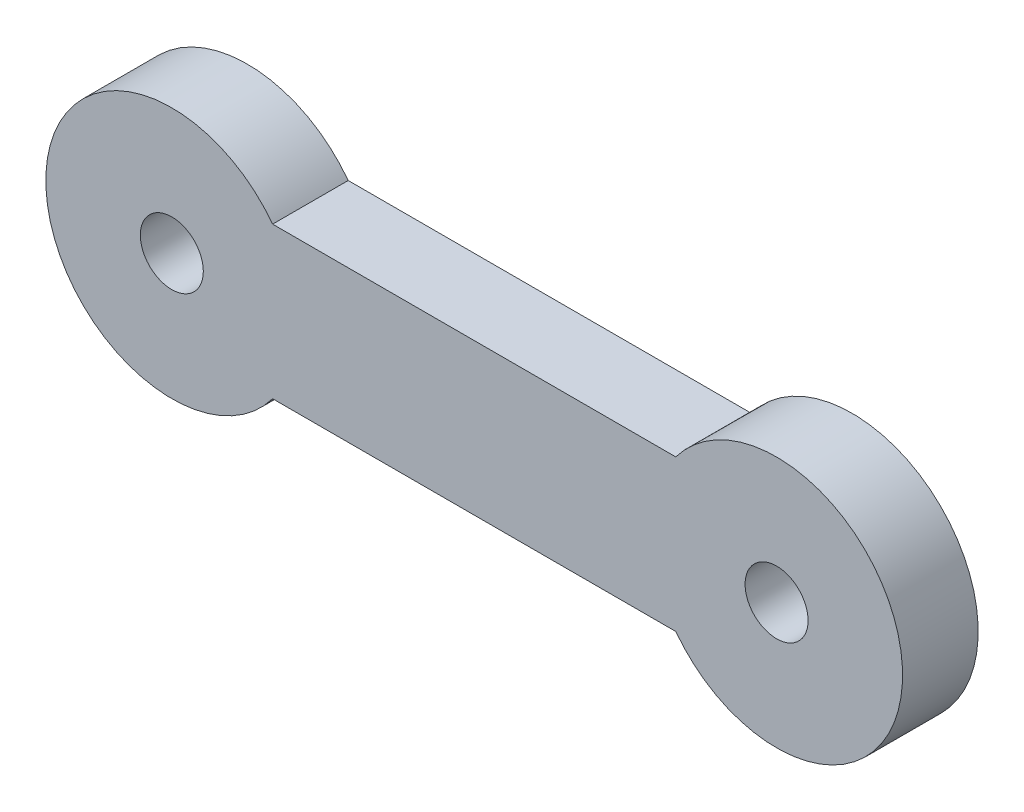
ISO-10303-21;
HEADER;
FILE_DESCRIPTION(('STEP AP214'),'2;1');
FILE_NAME('part.step','',(''),(''),'','','');
FILE_SCHEMA(('AUTOMOTIVE_DESIGN { 1 0 10303 214 1 1 1 1 }'));
ENDSEC;
DATA;
#1=APPLICATION_CONTEXT('core data for automotive mechanical design processes');
#2=APPLICATION_PROTOCOL_DEFINITION('international standard','automotive_design',2000,#1);
#3=PRODUCT_CONTEXT('',#1,'mechanical');
#4=PRODUCT('Part','Part','',(#3));
#5=PRODUCT_RELATED_PRODUCT_CATEGORY('part','',(#4));
#6=PRODUCT_DEFINITION_FORMATION('','',#4);
#7=PRODUCT_DEFINITION_CONTEXT('part definition',#1,'design');
#8=PRODUCT_DEFINITION('design','',#6,#7);
#9=PRODUCT_DEFINITION_SHAPE('','',#8);
#10=(LENGTH_UNIT() NAMED_UNIT(*) SI_UNIT(.MILLI.,.METRE.));
#11=(NAMED_UNIT(*) PLANE_ANGLE_UNIT() SI_UNIT($,.RADIAN.));
#12=(NAMED_UNIT(*) SI_UNIT($,.STERADIAN.) SOLID_ANGLE_UNIT());
#13=UNCERTAINTY_MEASURE_WITH_UNIT(LENGTH_MEASURE(1.E-05),#10,'distance_accuracy_value','');
#14=(GEOMETRIC_REPRESENTATION_CONTEXT(3) GLOBAL_UNCERTAINTY_ASSIGNED_CONTEXT((#13)) GLOBAL_UNIT_ASSIGNED_CONTEXT((#10,
#11,#12)) REPRESENTATION_CONTEXT('',''));
#15=CARTESIAN_POINT('',(0.,0.,0.));
#16=DIRECTION('',(0.,0.,1.));
#17=DIRECTION('',(1.,0.,0.));
#18=AXIS2_PLACEMENT_3D('',#15,#16,#17);
#19=CARTESIAN_POINT('',(-1.30622009569378,0.,3.));
#20=DIRECTION('',(0.,0.,1.));
#21=DIRECTION('',(1.,0.,0.));
#22=AXIS2_PLACEMENT_3D('',#19,#20,#21);
#23=PLANE('',#22);
#24=CARTESIAN_POINT('',(-1.30622009569378,0.,3.));
#25=DIRECTION('',(0.,0.,1.));
#26=DIRECTION('',(1.,0.,0.));
#27=AXIS2_PLACEMENT_3D('',#24,#25,#26);
#28=CIRCLE('',#27,1.25);
#29=CARTESIAN_POINT('',(-0.0562200956937802,0.,3.));
#30=VERTEX_POINT('',#29);
#31=EDGE_CURVE('E100',#30,#30,#28,.T.);
#32=ORIENTED_EDGE('',*,*,#31,.F.);
#33=EDGE_LOOP('',(#32));
#34=FACE_BOUND('',#33,.T.);
#35=CARTESIAN_POINT('',(-1.30622009569378,0.,3.));
#36=DIRECTION('',(0.,0.,1.));
#37=DIRECTION('',(1.,0.,0.));
#38=AXIS2_PLACEMENT_3D('',#35,#36,#37);
#39=CIRCLE('',#38,5.);
#40=CARTESIAN_POINT('',(2.69377990430622,3.,3.));
#41=VERTEX_POINT('',#40);
#42=CARTESIAN_POINT('',(2.69377990430622,-3.,3.));
#43=VERTEX_POINT('',#42);
#44=EDGE_CURVE('E85',#41,#43,#39,.T.);
#45=ORIENTED_EDGE('',*,*,#44,.T.);
#46=DIRECTION('',(1.,0.,0.));
#47=VECTOR('',#46,1.);
#48=CARTESIAN_POINT('',(2.69377990430622,-3.,3.));
#49=LINE('',#48,#47);
#50=CARTESIAN_POINT('',(18.6937799043062,-3.,3.));
#51=VERTEX_POINT('',#50);
#52=EDGE_CURVE('E80',#43,#51,#49,.T.);
#53=ORIENTED_EDGE('',*,*,#52,.T.);
#54=CARTESIAN_POINT('',(22.6937799043062,0.,3.));
#55=DIRECTION('',(0.,0.,1.));
#56=DIRECTION('',(1.,0.,0.));
#57=AXIS2_PLACEMENT_3D('',#54,#55,#56);
#58=CIRCLE('',#57,5.);
#59=CARTESIAN_POINT('',(18.6937799043062,3.,3.));
#60=VERTEX_POINT('',#59);
#61=EDGE_CURVE('E83',#51,#60,#58,.T.);
#62=ORIENTED_EDGE('',*,*,#61,.T.);
#63=DIRECTION('',(-1.,0.,0.));
#64=VECTOR('',#63,1.);
#65=CARTESIAN_POINT('',(2.69377990430622,3.,3.));
#66=LINE('',#65,#64);
#67=EDGE_CURVE('E50',#60,#41,#66,.T.);
#68=ORIENTED_EDGE('',*,*,#67,.T.);
#69=EDGE_LOOP('',(#45,#53,#62,#68));
#70=FACE_BOUND('',#69,.T.);
#71=CARTESIAN_POINT('',(22.6937799043062,0.,3.));
#72=DIRECTION('',(0.,0.,1.));
#73=DIRECTION('',(1.,0.,0.));
#74=AXIS2_PLACEMENT_3D('',#71,#72,#73);
#75=CIRCLE('',#74,1.25);
#76=CARTESIAN_POINT('',(23.9437799043062,0.,3.));
#77=VERTEX_POINT('',#76);
#78=EDGE_CURVE('E115',#77,#77,#75,.T.);
#79=ORIENTED_EDGE('',*,*,#78,.F.);
#80=EDGE_LOOP('',(#79));
#81=FACE_BOUND('',#80,.T.);
#82=ADVANCED_FACE('F33',(#34,#70,#81),#23,.T.);
#83=CARTESIAN_POINT('',(-1.30622009569378,0.,0.));
#84=DIRECTION('',(0.,0.,1.));
#85=DIRECTION('',(1.,0.,0.));
#86=AXIS2_PLACEMENT_3D('',#83,#84,#85);
#87=PLANE('',#86);
#88=CARTESIAN_POINT('',(-1.30622009569378,0.,0.));
#89=DIRECTION('',(0.,0.,1.));
#90=DIRECTION('',(1.,0.,0.));
#91=AXIS2_PLACEMENT_3D('',#88,#89,#90);
#92=CIRCLE('',#91,5.);
#93=CARTESIAN_POINT('',(2.69377990430622,3.,0.));
#94=VERTEX_POINT('',#93);
#95=CARTESIAN_POINT('',(2.69377990430622,-3.,0.));
#96=VERTEX_POINT('',#95);
#97=EDGE_CURVE('E97',#94,#96,#92,.T.);
#98=ORIENTED_EDGE('',*,*,#97,.F.);
#99=DIRECTION('',(-1.,0.,0.));
#100=VECTOR('',#99,1.);
#101=CARTESIAN_POINT('',(2.69377990430622,3.,0.));
#102=LINE('',#101,#100);
#103=CARTESIAN_POINT('',(18.6937799043062,3.,0.));
#104=VERTEX_POINT('',#103);
#105=EDGE_CURVE('E73',#104,#94,#102,.T.);
#106=ORIENTED_EDGE('',*,*,#105,.F.);
#107=CARTESIAN_POINT('',(22.6937799043062,0.,0.));
#108=DIRECTION('',(0.,0.,1.));
#109=DIRECTION('',(1.,0.,0.));
#110=AXIS2_PLACEMENT_3D('',#107,#108,#109);
#111=CIRCLE('',#110,5.);
#112=CARTESIAN_POINT('',(18.6937799043062,-3.,0.));
#113=VERTEX_POINT('',#112);
#114=EDGE_CURVE('E67',#113,#104,#111,.T.);
#115=ORIENTED_EDGE('',*,*,#114,.F.);
#116=DIRECTION('',(1.,0.,0.));
#117=VECTOR('',#116,1.);
#118=CARTESIAN_POINT('',(2.69377990430622,-3.,0.));
#119=LINE('',#118,#117);
#120=EDGE_CURVE('E89',#96,#113,#119,.T.);
#121=ORIENTED_EDGE('',*,*,#120,.F.);
#122=EDGE_LOOP('',(#98,#106,#115,#121));
#123=FACE_BOUND('',#122,.T.);
#124=CARTESIAN_POINT('',(-1.30622009569378,0.,0.));
#125=DIRECTION('',(0.,0.,1.));
#126=DIRECTION('',(1.,0.,0.));
#127=AXIS2_PLACEMENT_3D('',#124,#125,#126);
#128=CIRCLE('',#127,1.25);
#129=CARTESIAN_POINT('',(-0.0562200956937802,0.,0.));
#130=VERTEX_POINT('',#129);
#131=EDGE_CURVE('E112',#130,#130,#128,.T.);
#132=ORIENTED_EDGE('',*,*,#131,.T.);
#133=EDGE_LOOP('',(#132));
#134=FACE_BOUND('',#133,.T.);
#135=CARTESIAN_POINT('',(22.6937799043062,0.,0.));
#136=DIRECTION('',(0.,0.,1.));
#137=DIRECTION('',(1.,0.,0.));
#138=AXIS2_PLACEMENT_3D('',#135,#136,#137);
#139=CIRCLE('',#138,1.25);
#140=CARTESIAN_POINT('',(23.9437799043062,0.,0.));
#141=VERTEX_POINT('',#140);
#142=EDGE_CURVE('E118',#141,#141,#139,.T.);
#143=ORIENTED_EDGE('',*,*,#142,.T.);
#144=EDGE_LOOP('',(#143));
#145=FACE_BOUND('',#144,.T.);
#146=ADVANCED_FACE('F108',(#123,#134,#145),#87,.F.);
#147=CARTESIAN_POINT('',(-1.30622009569378,0.,3.));
#148=DIRECTION('',(0.,0.,-1.));
#149=DIRECTION('',(-1.,0.,0.));
#150=AXIS2_PLACEMENT_3D('',#147,#148,#149);
#151=CYLINDRICAL_SURFACE('',#150,5.);
#152=ORIENTED_EDGE('',*,*,#97,.T.);
#153=DIRECTION('',(0.,0.,-1.));
#154=VECTOR('',#153,1.);
#155=CARTESIAN_POINT('',(2.69377990430622,-3.,3.));
#156=LINE('',#155,#154);
#157=EDGE_CURVE('E11',#43,#96,#156,.T.);
#158=ORIENTED_EDGE('',*,*,#157,.F.);
#159=ORIENTED_EDGE('',*,*,#44,.F.);
#160=DIRECTION('',(0.,0.,-1.));
#161=VECTOR('',#160,1.);
#162=CARTESIAN_POINT('',(2.69377990430622,3.,3.));
#163=LINE('',#162,#161);
#164=EDGE_CURVE('E93',#41,#94,#163,.T.);
#165=ORIENTED_EDGE('',*,*,#164,.T.);
#166=EDGE_LOOP('',(#152,#158,#159,#165));
#167=FACE_BOUND('',#166,.T.);
#168=ADVANCED_FACE('F35',(#167),#151,.T.);
#169=CARTESIAN_POINT('',(2.69377990430622,-3.,3.));
#170=DIRECTION('',(0.,1.,0.));
#171=DIRECTION('',(0.,0.,1.));
#172=AXIS2_PLACEMENT_3D('',#169,#170,#171);
#173=PLANE('',#172);
#174=ORIENTED_EDGE('',*,*,#120,.T.);
#175=DIRECTION('',(0.,0.,-1.));
#176=VECTOR('',#175,1.);
#177=CARTESIAN_POINT('',(18.6937799043062,-3.,3.));
#178=LINE('',#177,#176);
#179=EDGE_CURVE('E42',#51,#113,#178,.T.);
#180=ORIENTED_EDGE('',*,*,#179,.F.);
#181=ORIENTED_EDGE('',*,*,#52,.F.);
#182=ORIENTED_EDGE('',*,*,#157,.T.);
#183=EDGE_LOOP('',(#174,#180,#181,#182));
#184=FACE_BOUND('',#183,.T.);
#185=ADVANCED_FACE('F88',(#184),#173,.F.);
#186=CARTESIAN_POINT('',(22.6937799043062,0.,3.));
#187=DIRECTION('',(0.,0.,-1.));
#188=DIRECTION('',(-1.,0.,0.));
#189=AXIS2_PLACEMENT_3D('',#186,#187,#188);
#190=CYLINDRICAL_SURFACE('',#189,5.);
#191=ORIENTED_EDGE('',*,*,#114,.T.);
#192=DIRECTION('',(0.,0.,-1.));
#193=VECTOR('',#192,1.);
#194=CARTESIAN_POINT('',(18.6937799043062,3.,3.));
#195=LINE('',#194,#193);
#196=EDGE_CURVE('E90',#60,#104,#195,.T.);
#197=ORIENTED_EDGE('',*,*,#196,.F.);
#198=ORIENTED_EDGE('',*,*,#61,.F.);
#199=ORIENTED_EDGE('',*,*,#179,.T.);
#200=EDGE_LOOP('',(#191,#197,#198,#199));
#201=FACE_BOUND('',#200,.T.);
#202=ADVANCED_FACE('F91',(#201),#190,.T.);
#203=CARTESIAN_POINT('',(2.69377990430622,3.,3.));
#204=DIRECTION('',(0.,-1.,0.));
#205=DIRECTION('',(0.,0.,-1.));
#206=AXIS2_PLACEMENT_3D('',#203,#204,#205);
#207=PLANE('',#206);
#208=ORIENTED_EDGE('',*,*,#105,.T.);
#209=ORIENTED_EDGE('',*,*,#164,.F.);
#210=ORIENTED_EDGE('',*,*,#67,.F.);
#211=ORIENTED_EDGE('',*,*,#196,.T.);
#212=EDGE_LOOP('',(#208,#209,#210,#211));
#213=FACE_BOUND('',#212,.T.);
#214=ADVANCED_FACE('F105',(#213),#207,.F.);
#215=CARTESIAN_POINT('',(-1.30622009569378,0.,3.));
#216=DIRECTION('',(0.,0.,-1.));
#217=DIRECTION('',(-1.,0.,0.));
#218=AXIS2_PLACEMENT_3D('',#215,#216,#217);
#219=CYLINDRICAL_SURFACE('',#218,1.25);
#220=ORIENTED_EDGE('',*,*,#31,.T.);
#221=EDGE_LOOP('',(#220));
#222=FACE_BOUND('',#221,.T.);
#223=ORIENTED_EDGE('',*,*,#131,.F.);
#224=EDGE_LOOP('',(#223));
#225=FACE_BOUND('',#224,.T.);
#226=ADVANCED_FACE('F135',(#222,#225),#219,.F.);
#227=CARTESIAN_POINT('',(22.6937799043062,0.,3.));
#228=DIRECTION('',(0.,0.,-1.));
#229=DIRECTION('',(-1.,0.,0.));
#230=AXIS2_PLACEMENT_3D('',#227,#228,#229);
#231=CYLINDRICAL_SURFACE('',#230,1.25);
#232=ORIENTED_EDGE('',*,*,#78,.T.);
#233=EDGE_LOOP('',(#232));
#234=FACE_BOUND('',#233,.T.);
#235=ORIENTED_EDGE('',*,*,#142,.F.);
#236=EDGE_LOOP('',(#235));
#237=FACE_BOUND('',#236,.T.);
#238=ADVANCED_FACE('F124',(#234,#237),#231,.F.);
#239=CLOSED_SHELL('',(#82,#146,#168,#185,#202,#214,#226,#238));
#240=MANIFOLD_SOLID_BREP('B2',#239);
#241=ADVANCED_BREP_SHAPE_REPRESENTATION('',(#18,#240),#14);
#242=SHAPE_DEFINITION_REPRESENTATION(#9,#241);
ENDSEC;
END-ISO-10303-21;
